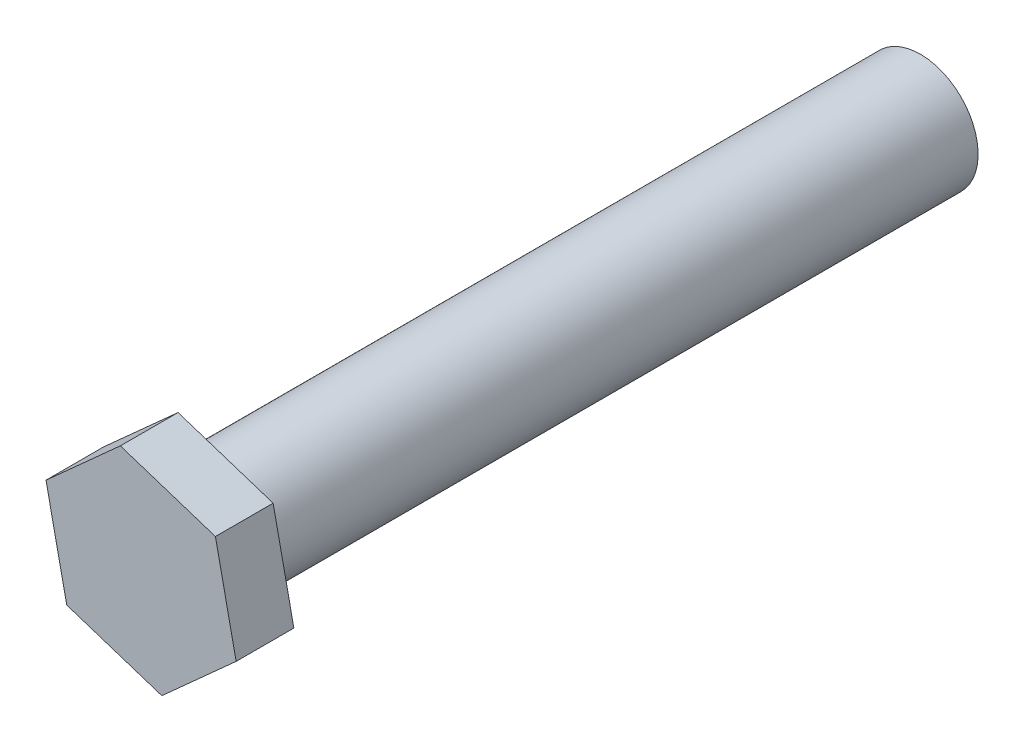
ISO-10303-21;
HEADER;
FILE_DESCRIPTION(('STEP AP214'),'2;1');
FILE_NAME('part.step','',(''),(''),'','','');
FILE_SCHEMA(('AUTOMOTIVE_DESIGN { 1 0 10303 214 1 1 1 1 }'));
ENDSEC;
DATA;
#1=APPLICATION_CONTEXT('core data for automotive mechanical design processes');
#2=APPLICATION_PROTOCOL_DEFINITION('international standard','automotive_design',2000,#1);
#3=PRODUCT_CONTEXT('',#1,'mechanical');
#4=PRODUCT('Part','Part','',(#3));
#5=PRODUCT_RELATED_PRODUCT_CATEGORY('part','',(#4));
#6=PRODUCT_DEFINITION_FORMATION('','',#4);
#7=PRODUCT_DEFINITION_CONTEXT('part definition',#1,'design');
#8=PRODUCT_DEFINITION('design','',#6,#7);
#9=PRODUCT_DEFINITION_SHAPE('','',#8);
#10=(LENGTH_UNIT() NAMED_UNIT(*) SI_UNIT(.MILLI.,.METRE.));
#11=(NAMED_UNIT(*) PLANE_ANGLE_UNIT() SI_UNIT($,.RADIAN.));
#12=(NAMED_UNIT(*) SI_UNIT($,.STERADIAN.) SOLID_ANGLE_UNIT());
#13=UNCERTAINTY_MEASURE_WITH_UNIT(LENGTH_MEASURE(1.E-05),#10,'distance_accuracy_value','');
#14=(GEOMETRIC_REPRESENTATION_CONTEXT(3) GLOBAL_UNCERTAINTY_ASSIGNED_CONTEXT((#13)) GLOBAL_UNIT_ASSIGNED_CONTEXT((#10,
#11,#12)) REPRESENTATION_CONTEXT('',''));
#15=CARTESIAN_POINT('',(0.,0.,0.));
#16=DIRECTION('',(0.,0.,1.));
#17=DIRECTION('',(1.,0.,0.));
#18=AXIS2_PLACEMENT_3D('',#15,#16,#17);
#19=CARTESIAN_POINT('',(156.422459422249,-209.373034199098,-582.));
#20=DIRECTION('',(0.,0.,-1.));
#21=DIRECTION('',(1.,0.,0.));
#22=AXIS2_PLACEMENT_3D('',#19,#20,#21);
#23=CYLINDRICAL_SURFACE('',#22,10.);
#24=CARTESIAN_POINT('',(156.422459422249,-209.373034199098,-582.));
#25=DIRECTION('',(0.,0.,-1.));
#26=DIRECTION('',(-1.,0.,0.));
#27=AXIS2_PLACEMENT_3D('',#24,#25,#26);
#28=CIRCLE('',#27,10.);
#29=CARTESIAN_POINT('',(146.422459422249,-209.373034199098,-582.));
#30=VERTEX_POINT('',#29);
#31=EDGE_CURVE('E11',#30,#30,#28,.T.);
#32=ORIENTED_EDGE('',*,*,#31,.T.);
#33=EDGE_LOOP('',(#32));
#34=FACE_BOUND('',#33,.T.);
#35=CARTESIAN_POINT('',(156.422459422249,-209.373034199098,-707.));
#36=DIRECTION('',(0.,0.,-1.));
#37=DIRECTION('',(-1.,0.,0.));
#38=AXIS2_PLACEMENT_3D('',#35,#36,#37);
#39=CIRCLE('',#38,10.);
#40=CARTESIAN_POINT('',(146.422459422249,-209.373034199098,-707.));
#41=VERTEX_POINT('',#40);
#42=EDGE_CURVE('E49',#41,#41,#39,.T.);
#43=ORIENTED_EDGE('',*,*,#42,.F.);
#44=EDGE_LOOP('',(#43));
#45=FACE_BOUND('',#44,.T.);
#46=ADVANCED_FACE('F41',(#34,#45),#23,.T.);
#47=CARTESIAN_POINT('',(156.422459422249,-209.373034199098,-707.));
#48=DIRECTION('',(0.,0.,1.));
#49=DIRECTION('',(-1.,0.,0.));
#50=AXIS2_PLACEMENT_3D('',#47,#48,#49);
#51=PLANE('',#50);
#52=ORIENTED_EDGE('',*,*,#42,.T.);
#53=EDGE_LOOP('',(#52));
#54=FACE_BOUND('',#53,.T.);
#55=ADVANCED_FACE('F148',(#54),#51,.F.);
#56=CARTESIAN_POINT('',(139.953027134932,-204.01040423485,-572.));
#57=DIRECTION('',(0.668665821694741,-0.743563056436572,0.));
#58=DIRECTION('',(0.743563056436572,0.668665821694741,0.));
#59=AXIS2_PLACEMENT_3D('',#56,#57,#58);
#60=PLANE('',#59);
#61=DIRECTION('',(0.743563056436572,0.668665821694741,0.));
#62=VECTOR('',#61,1.);
#63=CARTESIAN_POINT('',(139.953027134932,-204.01040423485,-582.));
#64=LINE('',#63,#62);
#65=CARTESIAN_POINT('',(139.953027134932,-204.01040423485,-582.));
#66=VERTEX_POINT('',#65);
#67=CARTESIAN_POINT('',(152.831917058725,-192.428772470249,-582.));
#68=VERTEX_POINT('',#67);
#69=EDGE_CURVE('E124',#66,#68,#64,.T.);
#70=ORIENTED_EDGE('',*,*,#69,.F.);
#71=DIRECTION('',(0.,0.,-1.));
#72=VECTOR('',#71,1.);
#73=CARTESIAN_POINT('',(139.953027134932,-204.01040423485,-572.));
#74=LINE('',#73,#72);
#75=CARTESIAN_POINT('',(139.953027134932,-204.01040423485,-572.));
#76=VERTEX_POINT('',#75);
#77=EDGE_CURVE('E123',#76,#66,#74,.T.);
#78=ORIENTED_EDGE('',*,*,#77,.F.);
#79=DIRECTION('',(0.743563056436572,0.668665821694741,0.));
#80=VECTOR('',#79,1.);
#81=CARTESIAN_POINT('',(139.953027134932,-204.01040423485,-572.));
#82=LINE('',#81,#80);
#83=CARTESIAN_POINT('',(152.831917058725,-192.428772470249,-572.));
#84=VERTEX_POINT('',#83);
#85=EDGE_CURVE('E136',#76,#84,#82,.T.);
#86=ORIENTED_EDGE('',*,*,#85,.T.);
#87=DIRECTION('',(0.,0.,-1.));
#88=VECTOR('',#87,1.);
#89=CARTESIAN_POINT('',(152.831917058725,-192.428772470249,-572.));
#90=LINE('',#89,#88);
#91=EDGE_CURVE('E143',#84,#68,#90,.T.);
#92=ORIENTED_EDGE('',*,*,#91,.T.);
#93=EDGE_LOOP('',(#70,#78,#86,#92));
#94=FACE_BOUND('',#93,.T.);
#95=ADVANCED_FACE('F156',(#94),#60,.F.);
#96=CARTESIAN_POINT('',(152.831917058725,-192.428772470249,-572.));
#97=DIRECTION('',(-0.309611585342302,-0.950863116448328,0.));
#98=DIRECTION('',(0.950863116448328,-0.309611585342302,0.));
#99=AXIS2_PLACEMENT_3D('',#96,#97,#98);
#100=PLANE('',#99);
#101=DIRECTION('',(0.950863116448328,-0.309611585342302,0.));
#102=VECTOR('',#101,1.);
#103=CARTESIAN_POINT('',(152.831917058725,-192.428772470249,-582.));
#104=LINE('',#103,#102);
#105=CARTESIAN_POINT('',(169.301349346043,-197.791402434498,-582.));
#106=VERTEX_POINT('',#105);
#107=EDGE_CURVE('E126',#68,#106,#104,.T.);
#108=ORIENTED_EDGE('',*,*,#107,.F.);
#109=ORIENTED_EDGE('',*,*,#91,.F.);
#110=DIRECTION('',(0.950863116448328,-0.309611585342302,0.));
#111=VECTOR('',#110,1.);
#112=CARTESIAN_POINT('',(152.831917058725,-192.428772470249,-572.));
#113=LINE('',#112,#111);
#114=CARTESIAN_POINT('',(169.301349346043,-197.791402434498,-572.));
#115=VERTEX_POINT('',#114);
#116=EDGE_CURVE('E89',#84,#115,#113,.T.);
#117=ORIENTED_EDGE('',*,*,#116,.T.);
#118=DIRECTION('',(0.,0.,-1.));
#119=VECTOR('',#118,1.);
#120=CARTESIAN_POINT('',(169.301349346043,-197.791402434498,-572.));
#121=LINE('',#120,#119);
#122=EDGE_CURVE('E140',#115,#106,#121,.T.);
#123=ORIENTED_EDGE('',*,*,#122,.T.);
#124=EDGE_LOOP('',(#108,#109,#117,#123));
#125=FACE_BOUND('',#124,.T.);
#126=ADVANCED_FACE('F167',(#125),#100,.F.);
#127=CARTESIAN_POINT('',(169.301349346043,-197.791402434498,-572.));
#128=DIRECTION('',(-0.978277407037044,-0.207300060011754,0.));
#129=DIRECTION('',(0.207300060011754,-0.978277407037044,0.));
#130=AXIS2_PLACEMENT_3D('',#127,#128,#129);
#131=PLANE('',#130);
#132=DIRECTION('',(0.207300060011754,-0.978277407037044,0.));
#133=VECTOR('',#132,1.);
#134=CARTESIAN_POINT('',(169.301349346043,-197.791402434498,-582.));
#135=LINE('',#134,#133);
#136=CARTESIAN_POINT('',(172.891891709567,-214.735664163347,-582.));
#137=VERTEX_POINT('',#136);
#138=EDGE_CURVE('E129',#106,#137,#135,.T.);
#139=ORIENTED_EDGE('',*,*,#138,.F.);
#140=ORIENTED_EDGE('',*,*,#122,.F.);
#141=DIRECTION('',(0.207300060011754,-0.978277407037044,0.));
#142=VECTOR('',#141,1.);
#143=CARTESIAN_POINT('',(169.301349346043,-197.791402434498,-572.));
#144=LINE('',#143,#142);
#145=CARTESIAN_POINT('',(172.891891709567,-214.735664163347,-572.));
#146=VERTEX_POINT('',#145);
#147=EDGE_CURVE('E117',#115,#146,#144,.T.);
#148=ORIENTED_EDGE('',*,*,#147,.T.);
#149=DIRECTION('',(0.,0.,-1.));
#150=VECTOR('',#149,1.);
#151=CARTESIAN_POINT('',(172.891891709567,-214.735664163347,-572.));
#152=LINE('',#151,#150);
#153=EDGE_CURVE('E111',#146,#137,#152,.T.);
#154=ORIENTED_EDGE('',*,*,#153,.T.);
#155=EDGE_LOOP('',(#139,#140,#148,#154));
#156=FACE_BOUND('',#155,.T.);
#157=ADVANCED_FACE('F170',(#156),#131,.F.);
#158=CARTESIAN_POINT('',(172.891891709567,-214.735664163347,-572.));
#159=DIRECTION('',(-0.668665821694741,0.743563056436572,0.));
#160=DIRECTION('',(-0.743563056436572,-0.668665821694742,0.));
#161=AXIS2_PLACEMENT_3D('',#158,#159,#160);
#162=PLANE('',#161);
#163=DIRECTION('',(-0.743563056436572,-0.668665821694742,0.));
#164=VECTOR('',#163,1.);
#165=CARTESIAN_POINT('',(172.891891709567,-214.735664163347,-582.));
#166=LINE('',#165,#164);
#167=CARTESIAN_POINT('',(160.013001785774,-226.317295927947,-582.));
#168=VERTEX_POINT('',#167);
#169=EDGE_CURVE('E132',#137,#168,#166,.T.);
#170=ORIENTED_EDGE('',*,*,#169,.F.);
#171=ORIENTED_EDGE('',*,*,#153,.F.);
#172=DIRECTION('',(-0.743563056436572,-0.668665821694742,0.));
#173=VECTOR('',#172,1.);
#174=CARTESIAN_POINT('',(172.891891709567,-214.735664163347,-572.));
#175=LINE('',#174,#173);
#176=CARTESIAN_POINT('',(160.013001785774,-226.317295927947,-572.));
#177=VERTEX_POINT('',#176);
#178=EDGE_CURVE('E101',#146,#177,#175,.T.);
#179=ORIENTED_EDGE('',*,*,#178,.T.);
#180=DIRECTION('',(0.,0.,-1.));
#181=VECTOR('',#180,1.);
#182=CARTESIAN_POINT('',(160.013001785774,-226.317295927947,-572.));
#183=LINE('',#182,#181);
#184=EDGE_CURVE('E106',#177,#168,#183,.T.);
#185=ORIENTED_EDGE('',*,*,#184,.T.);
#186=EDGE_LOOP('',(#170,#171,#179,#185));
#187=FACE_BOUND('',#186,.T.);
#188=ADVANCED_FACE('F114',(#187),#162,.F.);
#189=CARTESIAN_POINT('',(160.013001785774,-226.317295927947,-572.));
#190=DIRECTION('',(0.309611585342304,0.950863116448327,0.));
#191=DIRECTION('',(-0.950863116448327,0.309611585342304,0.));
#192=AXIS2_PLACEMENT_3D('',#189,#190,#191);
#193=PLANE('',#192);
#194=DIRECTION('',(-0.950863116448327,0.309611585342304,0.));
#195=VECTOR('',#194,1.);
#196=CARTESIAN_POINT('',(160.013001785774,-226.317295927947,-582.));
#197=LINE('',#196,#195);
#198=CARTESIAN_POINT('',(143.543569498456,-220.954665963699,-582.));
#199=VERTEX_POINT('',#198);
#200=EDGE_CURVE('E108',#168,#199,#197,.T.);
#201=ORIENTED_EDGE('',*,*,#200,.F.);
#202=ORIENTED_EDGE('',*,*,#184,.F.);
#203=DIRECTION('',(-0.950863116448327,0.309611585342304,0.));
#204=VECTOR('',#203,1.);
#205=CARTESIAN_POINT('',(160.013001785774,-226.317295927947,-572.));
#206=LINE('',#205,#204);
#207=CARTESIAN_POINT('',(143.543569498456,-220.954665963699,-572.));
#208=VERTEX_POINT('',#207);
#209=EDGE_CURVE('E97',#177,#208,#206,.T.);
#210=ORIENTED_EDGE('',*,*,#209,.T.);
#211=DIRECTION('',(0.,0.,-1.));
#212=VECTOR('',#211,1.);
#213=CARTESIAN_POINT('',(143.543569498456,-220.954665963699,-572.));
#214=LINE('',#213,#212);
#215=EDGE_CURVE('E112',#208,#199,#214,.T.);
#216=ORIENTED_EDGE('',*,*,#215,.T.);
#217=EDGE_LOOP('',(#201,#202,#210,#216));
#218=FACE_BOUND('',#217,.T.);
#219=ADVANCED_FACE('F107',(#218),#193,.F.);
#220=CARTESIAN_POINT('',(143.543569498456,-220.954665963699,-572.));
#221=DIRECTION('',(0.978277407037044,0.207300060011756,0.));
#222=DIRECTION('',(-0.207300060011756,0.978277407037044,0.));
#223=AXIS2_PLACEMENT_3D('',#220,#221,#222);
#224=PLANE('',#223);
#225=DIRECTION('',(-0.207300060011756,0.978277407037044,0.));
#226=VECTOR('',#225,1.);
#227=CARTESIAN_POINT('',(143.543569498456,-220.954665963699,-582.));
#228=LINE('',#227,#226);
#229=EDGE_CURVE('E77',#199,#66,#228,.T.);
#230=ORIENTED_EDGE('',*,*,#229,.F.);
#231=ORIENTED_EDGE('',*,*,#215,.F.);
#232=DIRECTION('',(-0.207300060011756,0.978277407037044,0.));
#233=VECTOR('',#232,1.);
#234=CARTESIAN_POINT('',(143.543569498456,-220.954665963699,-572.));
#235=LINE('',#234,#233);
#236=EDGE_CURVE('E57',#208,#76,#235,.T.);
#237=ORIENTED_EDGE('',*,*,#236,.T.);
#238=ORIENTED_EDGE('',*,*,#77,.T.);
#239=EDGE_LOOP('',(#230,#231,#237,#238));
#240=FACE_BOUND('',#239,.T.);
#241=ADVANCED_FACE('F225',(#240),#224,.F.);
#242=CARTESIAN_POINT('',(0.,0.,-572.));
#243=DIRECTION('',(0.,0.,1.));
#244=DIRECTION('',(-1.,0.,0.));
#245=AXIS2_PLACEMENT_3D('',#242,#243,#244);
#246=PLANE('',#245);
#247=ORIENTED_EDGE('',*,*,#85,.F.);
#248=ORIENTED_EDGE('',*,*,#236,.F.);
#249=ORIENTED_EDGE('',*,*,#209,.F.);
#250=ORIENTED_EDGE('',*,*,#178,.F.);
#251=ORIENTED_EDGE('',*,*,#147,.F.);
#252=ORIENTED_EDGE('',*,*,#116,.F.);
#253=EDGE_LOOP('',(#247,#248,#249,#250,#251,#252));
#254=FACE_BOUND('',#253,.T.);
#255=ADVANCED_FACE('F99',(#254),#246,.T.);
#256=CARTESIAN_POINT('',(0.,0.,-582.));
#257=DIRECTION('',(0.,0.,1.));
#258=DIRECTION('',(-1.,0.,0.));
#259=AXIS2_PLACEMENT_3D('',#256,#257,#258);
#260=PLANE('',#259);
#261=ORIENTED_EDGE('',*,*,#31,.F.);
#262=EDGE_LOOP('',(#261));
#263=FACE_BOUND('',#262,.T.);
#264=ORIENTED_EDGE('',*,*,#69,.T.);
#265=ORIENTED_EDGE('',*,*,#107,.T.);
#266=ORIENTED_EDGE('',*,*,#138,.T.);
#267=ORIENTED_EDGE('',*,*,#169,.T.);
#268=ORIENTED_EDGE('',*,*,#200,.T.);
#269=ORIENTED_EDGE('',*,*,#229,.T.);
#270=EDGE_LOOP('',(#264,#265,#266,#267,#268,#269));
#271=FACE_BOUND('',#270,.T.);
#272=ADVANCED_FACE('F159',(#263,#271),#260,.F.);
#273=CLOSED_SHELL('',(#46,#55,#95,#126,#157,#188,#219,#241,#255,#272));
#274=MANIFOLD_SOLID_BREP('B2',#273);
#275=ADVANCED_BREP_SHAPE_REPRESENTATION('',(#18,#274),#14);
#276=SHAPE_DEFINITION_REPRESENTATION(#9,#275);
ENDSEC;
END-ISO-10303-21;
